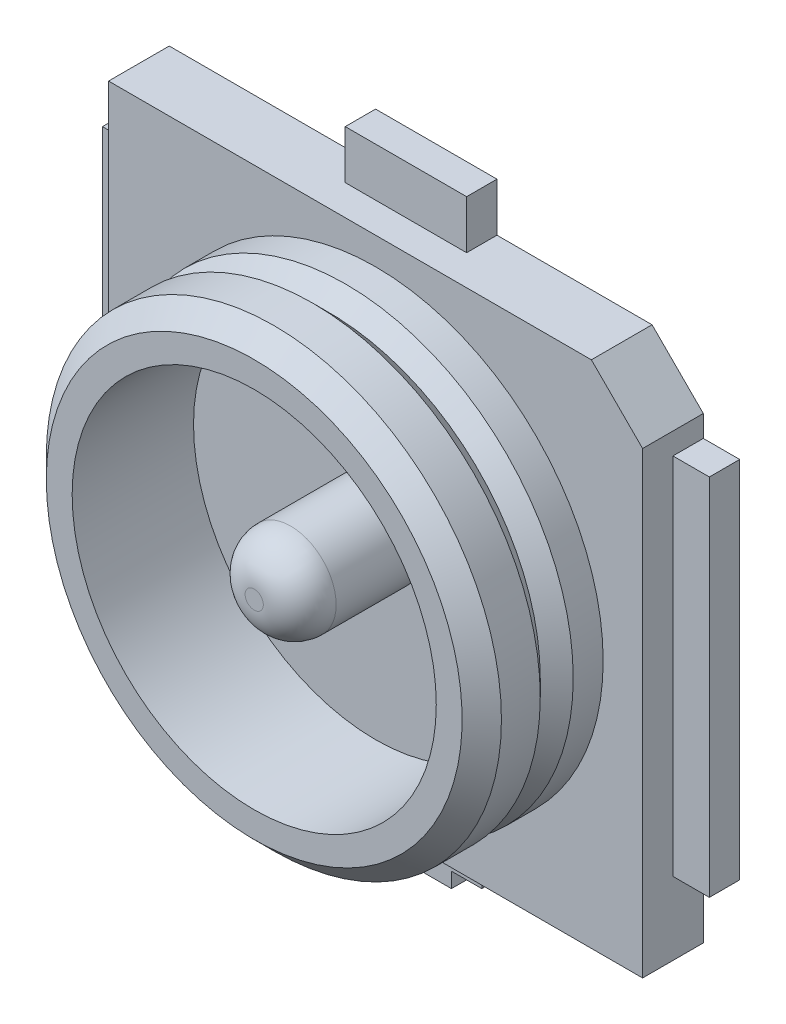
ISO-10303-21;
HEADER;
FILE_DESCRIPTION(('STEP AP214'),'2;1');
FILE_NAME('part.step','',(''),(''),'','','');
FILE_SCHEMA(('AUTOMOTIVE_DESIGN { 1 0 10303 214 1 1 1 1 }'));
ENDSEC;
DATA;
#1=APPLICATION_CONTEXT('core data for automotive mechanical design processes');
#2=APPLICATION_PROTOCOL_DEFINITION('international standard','automotive_design',2000,#1);
#3=PRODUCT_CONTEXT('',#1,'mechanical');
#4=PRODUCT('Part','Part','',(#3));
#5=PRODUCT_RELATED_PRODUCT_CATEGORY('part','',(#4));
#6=PRODUCT_DEFINITION_FORMATION('','',#4);
#7=PRODUCT_DEFINITION_CONTEXT('part definition',#1,'design');
#8=PRODUCT_DEFINITION('design','',#6,#7);
#9=PRODUCT_DEFINITION_SHAPE('','',#8);
#10=(LENGTH_UNIT() NAMED_UNIT(*) SI_UNIT(.MILLI.,.METRE.));
#11=(NAMED_UNIT(*) PLANE_ANGLE_UNIT() SI_UNIT($,.RADIAN.));
#12=(NAMED_UNIT(*) SI_UNIT($,.STERADIAN.) SOLID_ANGLE_UNIT());
#13=UNCERTAINTY_MEASURE_WITH_UNIT(LENGTH_MEASURE(1.E-05),#10,'distance_accuracy_value','');
#14=(GEOMETRIC_REPRESENTATION_CONTEXT(3) GLOBAL_UNCERTAINTY_ASSIGNED_CONTEXT((#13)) GLOBAL_UNIT_ASSIGNED_CONTEXT((#10,
#11,#12)) REPRESENTATION_CONTEXT('',''));
#15=CARTESIAN_POINT('',(0.,0.,0.));
#16=DIRECTION('',(0.,0.,1.));
#17=DIRECTION('',(1.,0.,0.));
#18=AXIS2_PLACEMENT_3D('',#15,#16,#17);
#19=CARTESIAN_POINT('',(0.88,-0.84,0.2));
#20=DIRECTION('',(-1.,0.,0.));
#21=DIRECTION('',(0.,-1.,0.));
#22=AXIS2_PLACEMENT_3D('',#19,#20,#21);
#23=PLANE('',#22);
#24=DIRECTION('',(0.,0.,-1.));
#25=VECTOR('',#24,1.);
#26=CARTESIAN_POINT('',(0.88,-0.6,0.1));
#27=LINE('',#26,#25);
#28=CARTESIAN_POINT('',(0.88,-0.6,0.1));
#29=VERTEX_POINT('',#28);
#30=CARTESIAN_POINT('',(0.88,-0.6,0.));
#31=VERTEX_POINT('',#30);
#32=EDGE_CURVE('E215',#29,#31,#27,.T.);
#33=ORIENTED_EDGE('',*,*,#32,.F.);
#34=DIRECTION('',(0.,-1.,0.));
#35=VECTOR('',#34,1.);
#36=CARTESIAN_POINT('',(0.88,0.6,0.1));
#37=LINE('',#36,#35);
#38=CARTESIAN_POINT('',(0.88,0.6,0.1));
#39=VERTEX_POINT('',#38);
#40=EDGE_CURVE('E223',#39,#29,#37,.T.);
#41=ORIENTED_EDGE('',*,*,#40,.F.);
#42=DIRECTION('',(0.,0.,-1.));
#43=VECTOR('',#42,1.);
#44=CARTESIAN_POINT('',(0.88,0.6,0.1));
#45=LINE('',#44,#43);
#46=CARTESIAN_POINT('',(0.88,0.6,0.));
#47=VERTEX_POINT('',#46);
#48=EDGE_CURVE('E585',#39,#47,#45,.T.);
#49=ORIENTED_EDGE('',*,*,#48,.T.);
#50=DIRECTION('',(0.,1.,0.));
#51=VECTOR('',#50,1.);
#52=CARTESIAN_POINT('',(0.88,-0.84,0.));
#53=LINE('',#52,#51);
#54=CARTESIAN_POINT('',(0.88,0.671160981319891,0.));
#55=VERTEX_POINT('',#54);
#56=EDGE_CURVE('E449',#47,#55,#53,.T.);
#57=ORIENTED_EDGE('',*,*,#56,.T.);
#58=DIRECTION('',(0.,0.,-1.));
#59=VECTOR('',#58,1.);
#60=CARTESIAN_POINT('',(0.88,0.671160981319891,0.2));
#61=LINE('',#60,#59);
#62=CARTESIAN_POINT('',(0.88,0.671160981319891,0.2));
#63=VERTEX_POINT('',#62);
#64=EDGE_CURVE('E463',#63,#55,#61,.T.);
#65=ORIENTED_EDGE('',*,*,#64,.F.);
#66=DIRECTION('',(0.,1.,0.));
#67=VECTOR('',#66,1.);
#68=CARTESIAN_POINT('',(0.88,-0.84,0.2));
#69=LINE('',#68,#67);
#70=CARTESIAN_POINT('',(0.88,-0.84,0.2));
#71=VERTEX_POINT('',#70);
#72=EDGE_CURVE('E429',#71,#63,#69,.T.);
#73=ORIENTED_EDGE('',*,*,#72,.F.);
#74=DIRECTION('',(0.,0.,-1.));
#75=VECTOR('',#74,1.);
#76=CARTESIAN_POINT('',(0.88,-0.84,0.2));
#77=LINE('',#76,#75);
#78=CARTESIAN_POINT('',(0.88,-0.84,0.));
#79=VERTEX_POINT('',#78);
#80=EDGE_CURVE('E460',#71,#79,#77,.T.);
#81=ORIENTED_EDGE('',*,*,#80,.T.);
#82=EDGE_CURVE('E234',#79,#31,#53,.T.);
#83=ORIENTED_EDGE('',*,*,#82,.T.);
#84=EDGE_LOOP('',(#33,#41,#49,#57,#65,#73,#81,#83));
#85=FACE_BOUND('',#84,.T.);
#86=ADVANCED_FACE('F39',(#85),#23,.F.);
#87=CARTESIAN_POINT('',(-0.88,-0.84,0.2));
#88=DIRECTION('',(0.,1.,0.));
#89=DIRECTION('',(0.,0.,1.));
#90=AXIS2_PLACEMENT_3D('',#87,#88,#89);
#91=PLANE('',#90);
#92=DIRECTION('',(0.,0.,-1.));
#93=VECTOR('',#92,1.);
#94=CARTESIAN_POINT('',(-0.25,-0.84,0.1));
#95=LINE('',#94,#93);
#96=CARTESIAN_POINT('',(-0.25,-0.84,0.1));
#97=VERTEX_POINT('',#96);
#98=CARTESIAN_POINT('',(-0.25,-0.84,0.));
#99=VERTEX_POINT('',#98);
#100=EDGE_CURVE('E304',#97,#99,#95,.T.);
#101=ORIENTED_EDGE('',*,*,#100,.F.);
#102=DIRECTION('',(-1.,0.,0.));
#103=VECTOR('',#102,1.);
#104=CARTESIAN_POINT('',(-0.25,-0.84,0.1));
#105=LINE('',#104,#103);
#106=CARTESIAN_POINT('',(0.25,-0.84,0.1));
#107=VERTEX_POINT('',#106);
#108=EDGE_CURVE('E301',#107,#97,#105,.T.);
#109=ORIENTED_EDGE('',*,*,#108,.F.);
#110=DIRECTION('',(0.,0.,-1.));
#111=VECTOR('',#110,1.);
#112=CARTESIAN_POINT('',(0.25,-0.84,0.1));
#113=LINE('',#112,#111);
#114=CARTESIAN_POINT('',(0.25,-0.84,0.));
#115=VERTEX_POINT('',#114);
#116=EDGE_CURVE('E327',#107,#115,#113,.T.);
#117=ORIENTED_EDGE('',*,*,#116,.T.);
#118=DIRECTION('',(1.,0.,0.));
#119=VECTOR('',#118,1.);
#120=CARTESIAN_POINT('',(-0.88,-0.84,0.));
#121=LINE('',#120,#119);
#122=EDGE_CURVE('E452',#115,#79,#121,.T.);
#123=ORIENTED_EDGE('',*,*,#122,.T.);
#124=ORIENTED_EDGE('',*,*,#80,.F.);
#125=DIRECTION('',(1.,0.,0.));
#126=VECTOR('',#125,1.);
#127=CARTESIAN_POINT('',(-0.88,-0.84,0.2));
#128=LINE('',#127,#126);
#129=CARTESIAN_POINT('',(-0.88,-0.84,0.2));
#130=VERTEX_POINT('',#129);
#131=EDGE_CURVE('E432',#130,#71,#128,.T.);
#132=ORIENTED_EDGE('',*,*,#131,.F.);
#133=DIRECTION('',(0.,0.,-1.));
#134=VECTOR('',#133,1.);
#135=CARTESIAN_POINT('',(-0.88,-0.84,0.2));
#136=LINE('',#135,#134);
#137=CARTESIAN_POINT('',(-0.88,-0.84,0.));
#138=VERTEX_POINT('',#137);
#139=EDGE_CURVE('E456',#130,#138,#136,.T.);
#140=ORIENTED_EDGE('',*,*,#139,.T.);
#141=EDGE_CURVE('E421',#138,#99,#121,.T.);
#142=ORIENTED_EDGE('',*,*,#141,.T.);
#143=EDGE_LOOP('',(#101,#109,#117,#123,#124,#132,#140,#142));
#144=FACE_BOUND('',#143,.T.);
#145=ADVANCED_FACE('F504',(#144),#91,.F.);
#146=CARTESIAN_POINT('',(0.,0.,0.2));
#147=DIRECTION('',(0.,0.,-1.));
#148=DIRECTION('',(-1.,0.,0.));
#149=AXIS2_PLACEMENT_3D('',#146,#147,#148);
#150=PLANE('',#149);
#151=DIRECTION('',(0.,1.,0.));
#152=VECTOR('',#151,1.);
#153=CARTESIAN_POINT('',(-0.88,-0.84,0.2));
#154=LINE('',#153,#152);
#155=CARTESIAN_POINT('',(-0.88,0.84,0.2));
#156=VERTEX_POINT('',#155);
#157=EDGE_CURVE('E416',#130,#156,#154,.T.);
#158=ORIENTED_EDGE('',*,*,#157,.F.);
#159=ORIENTED_EDGE('',*,*,#131,.T.);
#160=ORIENTED_EDGE('',*,*,#72,.T.);
#161=DIRECTION('',(0.707106781186556,-0.707106781186539,0.));
#162=VECTOR('',#161,1.);
#163=CARTESIAN_POINT('',(0.711160981319886,0.84,0.2));
#164=LINE('',#163,#162);
#165=CARTESIAN_POINT('',(0.711160981319886,0.84,0.2));
#166=VERTEX_POINT('',#165);
#167=EDGE_CURVE('E425',#166,#63,#164,.T.);
#168=ORIENTED_EDGE('',*,*,#167,.F.);
#169=DIRECTION('',(1.,0.,0.));
#170=VECTOR('',#169,1.);
#171=CARTESIAN_POINT('',(-0.88,0.84,0.2));
#172=LINE('',#171,#170);
#173=EDGE_CURVE('E420',#156,#166,#172,.T.);
#174=ORIENTED_EDGE('',*,*,#173,.F.);
#175=EDGE_LOOP('',(#158,#159,#160,#168,#174));
#176=FACE_BOUND('',#175,.T.);
#177=CARTESIAN_POINT('',(0.,0.,0.2));
#178=DIRECTION('',(0.,0.,-1.));
#179=DIRECTION('',(-1.,0.,0.));
#180=AXIS2_PLACEMENT_3D('',#177,#178,#179);
#181=CIRCLE('',#180,0.75);
#182=CARTESIAN_POINT('',(-0.75,0.,0.2));
#183=VERTEX_POINT('',#182);
#184=EDGE_CURVE('E477',#183,#183,#181,.F.);
#185=ORIENTED_EDGE('',*,*,#184,.F.);
#186=EDGE_LOOP('',(#185));
#187=FACE_BOUND('',#186,.T.);
#188=ADVANCED_FACE('F509',(#176,#187),#150,.F.);
#189=CARTESIAN_POINT('',(-0.88,-0.84,0.2));
#190=DIRECTION('',(-1.,0.,0.));
#191=DIRECTION('',(0.,0.,1.));
#192=AXIS2_PLACEMENT_3D('',#189,#190,#191);
#193=PLANE('',#192);
#194=DIRECTION('',(0.,0.,-1.));
#195=VECTOR('',#194,1.);
#196=CARTESIAN_POINT('',(-0.88,0.6,0.1));
#197=LINE('',#196,#195);
#198=CARTESIAN_POINT('',(-0.88,0.6,0.1));
#199=VERTEX_POINT('',#198);
#200=CARTESIAN_POINT('',(-0.88,0.6,0.));
#201=VERTEX_POINT('',#200);
#202=EDGE_CURVE('E273',#199,#201,#197,.T.);
#203=ORIENTED_EDGE('',*,*,#202,.F.);
#204=DIRECTION('',(0.,1.,0.));
#205=VECTOR('',#204,1.);
#206=CARTESIAN_POINT('',(-0.88,0.6,0.1));
#207=LINE('',#206,#205);
#208=CARTESIAN_POINT('',(-0.88,-0.6,0.1));
#209=VERTEX_POINT('',#208);
#210=EDGE_CURVE('E246',#209,#199,#207,.T.);
#211=ORIENTED_EDGE('',*,*,#210,.F.);
#212=DIRECTION('',(0.,0.,-1.));
#213=VECTOR('',#212,1.);
#214=CARTESIAN_POINT('',(-0.88,-0.6,0.1));
#215=LINE('',#214,#213);
#216=CARTESIAN_POINT('',(-0.88,-0.6,0.));
#217=VERTEX_POINT('',#216);
#218=EDGE_CURVE('E258',#209,#217,#215,.T.);
#219=ORIENTED_EDGE('',*,*,#218,.T.);
#220=DIRECTION('',(0.,1.,0.));
#221=VECTOR('',#220,1.);
#222=CARTESIAN_POINT('',(-0.88,-0.84,0.));
#223=LINE('',#222,#221);
#224=EDGE_CURVE('E436',#138,#217,#223,.T.);
#225=ORIENTED_EDGE('',*,*,#224,.F.);
#226=ORIENTED_EDGE('',*,*,#139,.F.);
#227=ORIENTED_EDGE('',*,*,#157,.T.);
#228=DIRECTION('',(0.,0.,-1.));
#229=VECTOR('',#228,1.);
#230=CARTESIAN_POINT('',(-0.88,0.84,0.2));
#231=LINE('',#230,#229);
#232=CARTESIAN_POINT('',(-0.88,0.84,0.));
#233=VERTEX_POINT('',#232);
#234=EDGE_CURVE('E435',#156,#233,#231,.T.);
#235=ORIENTED_EDGE('',*,*,#234,.T.);
#236=EDGE_CURVE('E415',#201,#233,#223,.T.);
#237=ORIENTED_EDGE('',*,*,#236,.F.);
#238=EDGE_LOOP('',(#203,#211,#219,#225,#226,#227,#235,#237));
#239=FACE_BOUND('',#238,.T.);
#240=ADVANCED_FACE('F518',(#239),#193,.T.);
#241=CARTESIAN_POINT('',(0.711160981319886,0.84,0.2));
#242=DIRECTION('',(0.707106781186539,0.707106781186556,0.));
#243=DIRECTION('',(-0.707106781186556,0.707106781186539,0.));
#244=AXIS2_PLACEMENT_3D('',#241,#242,#243);
#245=PLANE('',#244);
#246=DIRECTION('',(0.707106781186556,-0.707106781186539,0.));
#247=VECTOR('',#246,1.);
#248=CARTESIAN_POINT('',(0.711160981319886,0.84,0.));
#249=LINE('',#248,#247);
#250=CARTESIAN_POINT('',(0.711160981319886,0.84,0.));
#251=VERTEX_POINT('',#250);
#252=EDGE_CURVE('E445',#251,#55,#249,.T.);
#253=ORIENTED_EDGE('',*,*,#252,.F.);
#254=DIRECTION('',(0.,0.,-1.));
#255=VECTOR('',#254,1.);
#256=CARTESIAN_POINT('',(0.711160981319886,0.84,0.2));
#257=LINE('',#256,#255);
#258=EDGE_CURVE('E467',#166,#251,#257,.T.);
#259=ORIENTED_EDGE('',*,*,#258,.F.);
#260=ORIENTED_EDGE('',*,*,#167,.T.);
#261=ORIENTED_EDGE('',*,*,#64,.T.);
#262=EDGE_LOOP('',(#253,#259,#260,#261));
#263=FACE_BOUND('',#262,.T.);
#264=ADVANCED_FACE('F514',(#263),#245,.T.);
#265=CARTESIAN_POINT('',(-0.88,0.84,0.2));
#266=DIRECTION('',(0.,1.,0.));
#267=DIRECTION('',(0.,0.,1.));
#268=AXIS2_PLACEMENT_3D('',#265,#266,#267);
#269=PLANE('',#268);
#270=DIRECTION('',(0.,0.,-1.));
#271=VECTOR('',#270,1.);
#272=CARTESIAN_POINT('',(0.2,0.84,0.1));
#273=LINE('',#272,#271);
#274=CARTESIAN_POINT('',(0.2,0.84,0.1));
#275=VERTEX_POINT('',#274);
#276=CARTESIAN_POINT('',(0.2,0.84,0.));
#277=VERTEX_POINT('',#276);
#278=EDGE_CURVE('E384',#275,#277,#273,.T.);
#279=ORIENTED_EDGE('',*,*,#278,.F.);
#280=DIRECTION('',(1.,0.,0.));
#281=VECTOR('',#280,1.);
#282=CARTESIAN_POINT('',(-0.2,0.84,0.1));
#283=LINE('',#282,#281);
#284=CARTESIAN_POINT('',(-0.2,0.84,0.1));
#285=VERTEX_POINT('',#284);
#286=EDGE_CURVE('E359',#285,#275,#283,.T.);
#287=ORIENTED_EDGE('',*,*,#286,.F.);
#288=DIRECTION('',(0.,0.,-1.));
#289=VECTOR('',#288,1.);
#290=CARTESIAN_POINT('',(-0.2,0.84,0.1));
#291=LINE('',#290,#289);
#292=CARTESIAN_POINT('',(-0.2,0.84,0.));
#293=VERTEX_POINT('',#292);
#294=EDGE_CURVE('E387',#285,#293,#291,.T.);
#295=ORIENTED_EDGE('',*,*,#294,.T.);
#296=DIRECTION('',(1.,0.,0.));
#297=VECTOR('',#296,1.);
#298=CARTESIAN_POINT('',(-0.88,0.84,0.));
#299=LINE('',#298,#297);
#300=EDGE_CURVE('E441',#233,#293,#299,.T.);
#301=ORIENTED_EDGE('',*,*,#300,.F.);
#302=ORIENTED_EDGE('',*,*,#234,.F.);
#303=ORIENTED_EDGE('',*,*,#173,.T.);
#304=ORIENTED_EDGE('',*,*,#258,.T.);
#305=EDGE_CURVE('E440',#277,#251,#299,.T.);
#306=ORIENTED_EDGE('',*,*,#305,.F.);
#307=EDGE_LOOP('',(#279,#287,#295,#301,#302,#303,#304,#306));
#308=FACE_BOUND('',#307,.T.);
#309=ADVANCED_FACE('F517',(#308),#269,.T.);
#310=CARTESIAN_POINT('',(0.,0.,0.));
#311=DIRECTION('',(0.,0.,-1.));
#312=DIRECTION('',(-1.,0.,0.));
#313=AXIS2_PLACEMENT_3D('',#310,#311,#312);
#314=PLANE('',#313);
#315=ORIENTED_EDGE('',*,*,#224,.T.);
#316=DIRECTION('',(1.,0.,0.));
#317=VECTOR('',#316,1.);
#318=CARTESIAN_POINT('',(-0.88,-0.6,0.));
#319=LINE('',#318,#317);
#320=CARTESIAN_POINT('',(-1.,-0.6,0.));
#321=VERTEX_POINT('',#320);
#322=EDGE_CURVE('E63',#321,#217,#319,.T.);
#323=ORIENTED_EDGE('',*,*,#322,.F.);
#324=DIRECTION('',(0.,-1.,0.));
#325=VECTOR('',#324,1.);
#326=CARTESIAN_POINT('',(-1.,0.6,0.));
#327=LINE('',#326,#325);
#328=CARTESIAN_POINT('',(-1.,0.6,0.));
#329=VERTEX_POINT('',#328);
#330=EDGE_CURVE('E240',#329,#321,#327,.T.);
#331=ORIENTED_EDGE('',*,*,#330,.F.);
#332=DIRECTION('',(-1.,0.,0.));
#333=VECTOR('',#332,1.);
#334=CARTESIAN_POINT('',(-0.88,0.6,0.));
#335=LINE('',#334,#333);
#336=EDGE_CURVE('E236',#201,#329,#335,.T.);
#337=ORIENTED_EDGE('',*,*,#336,.F.);
#338=ORIENTED_EDGE('',*,*,#236,.T.);
#339=ORIENTED_EDGE('',*,*,#300,.T.);
#340=DIRECTION('',(0.,-1.,0.));
#341=VECTOR('',#340,1.);
#342=CARTESIAN_POINT('',(-0.2,0.84,0.));
#343=LINE('',#342,#341);
#344=CARTESIAN_POINT('',(-0.2,1.,0.));
#345=VERTEX_POINT('',#344);
#346=EDGE_CURVE('E355',#345,#293,#343,.T.);
#347=ORIENTED_EDGE('',*,*,#346,.F.);
#348=DIRECTION('',(-1.,0.,0.));
#349=VECTOR('',#348,1.);
#350=CARTESIAN_POINT('',(-0.2,1.,0.));
#351=LINE('',#350,#349);
#352=CARTESIAN_POINT('',(0.2,1.,0.));
#353=VERTEX_POINT('',#352);
#354=EDGE_CURVE('E360',#353,#345,#351,.T.);
#355=ORIENTED_EDGE('',*,*,#354,.F.);
#356=DIRECTION('',(0.,1.,0.));
#357=VECTOR('',#356,1.);
#358=CARTESIAN_POINT('',(0.2,0.84,0.));
#359=LINE('',#358,#357);
#360=EDGE_CURVE('E372',#277,#353,#359,.T.);
#361=ORIENTED_EDGE('',*,*,#360,.F.);
#362=ORIENTED_EDGE('',*,*,#305,.T.);
#363=ORIENTED_EDGE('',*,*,#252,.T.);
#364=ORIENTED_EDGE('',*,*,#56,.F.);
#365=DIRECTION('',(-1.,0.,0.));
#366=VECTOR('',#365,1.);
#367=CARTESIAN_POINT('',(0.88,0.6,0.));
#368=LINE('',#367,#366);
#369=CARTESIAN_POINT('',(1.,0.6,0.));
#370=VERTEX_POINT('',#369);
#371=EDGE_CURVE('E55',#370,#47,#368,.T.);
#372=ORIENTED_EDGE('',*,*,#371,.F.);
#373=DIRECTION('',(0.,1.,0.));
#374=VECTOR('',#373,1.);
#375=CARTESIAN_POINT('',(1.,0.6,0.));
#376=LINE('',#375,#374);
#377=CARTESIAN_POINT('',(1.,-0.6,0.));
#378=VERTEX_POINT('',#377);
#379=EDGE_CURVE('E575',#378,#370,#376,.T.);
#380=ORIENTED_EDGE('',*,*,#379,.F.);
#381=DIRECTION('',(1.,0.,0.));
#382=VECTOR('',#381,1.);
#383=CARTESIAN_POINT('',(0.88,-0.6,0.));
#384=LINE('',#383,#382);
#385=EDGE_CURVE('E574',#31,#378,#384,.T.);
#386=ORIENTED_EDGE('',*,*,#385,.F.);
#387=ORIENTED_EDGE('',*,*,#82,.F.);
#388=ORIENTED_EDGE('',*,*,#122,.F.);
#389=DIRECTION('',(0.,1.,0.));
#390=VECTOR('',#389,1.);
#391=CARTESIAN_POINT('',(0.25,-0.84,0.));
#392=LINE('',#391,#390);
#393=CARTESIAN_POINT('',(0.25,-0.95,0.));
#394=VERTEX_POINT('',#393);
#395=EDGE_CURVE('E283',#394,#115,#392,.T.);
#396=ORIENTED_EDGE('',*,*,#395,.F.);
#397=DIRECTION('',(1.,0.,0.));
#398=VECTOR('',#397,1.);
#399=CARTESIAN_POINT('',(0.25,-0.95,0.));
#400=LINE('',#399,#398);
#401=CARTESIAN_POINT('',(0.15,-0.95,0.));
#402=VERTEX_POINT('',#401);
#403=EDGE_CURVE('E320',#402,#394,#400,.T.);
#404=ORIENTED_EDGE('',*,*,#403,.F.);
#405=DIRECTION('',(0.,1.,0.));
#406=VECTOR('',#405,1.);
#407=CARTESIAN_POINT('',(0.15,-0.95,0.));
#408=LINE('',#407,#406);
#409=CARTESIAN_POINT('',(0.15,-1.,0.));
#410=VERTEX_POINT('',#409);
#411=EDGE_CURVE('E317',#410,#402,#408,.T.);
#412=ORIENTED_EDGE('',*,*,#411,.F.);
#413=DIRECTION('',(1.,0.,0.));
#414=VECTOR('',#413,1.);
#415=CARTESIAN_POINT('',(-0.15,-1.,0.));
#416=LINE('',#415,#414);
#417=CARTESIAN_POINT('',(-0.15,-1.,0.));
#418=VERTEX_POINT('',#417);
#419=EDGE_CURVE('E314',#418,#410,#416,.T.);
#420=ORIENTED_EDGE('',*,*,#419,.F.);
#421=DIRECTION('',(0.,-1.,0.));
#422=VECTOR('',#421,1.);
#423=CARTESIAN_POINT('',(-0.15,-0.95,0.));
#424=LINE('',#423,#422);
#425=CARTESIAN_POINT('',(-0.15,-0.95,0.));
#426=VERTEX_POINT('',#425);
#427=EDGE_CURVE('E311',#426,#418,#424,.T.);
#428=ORIENTED_EDGE('',*,*,#427,.F.);
#429=DIRECTION('',(1.,0.,0.));
#430=VECTOR('',#429,1.);
#431=CARTESIAN_POINT('',(-0.25,-0.95,0.));
#432=LINE('',#431,#430);
#433=CARTESIAN_POINT('',(-0.25,-0.95,0.));
#434=VERTEX_POINT('',#433);
#435=EDGE_CURVE('E308',#434,#426,#432,.T.);
#436=ORIENTED_EDGE('',*,*,#435,.F.);
#437=DIRECTION('',(0.,-1.,0.));
#438=VECTOR('',#437,1.);
#439=CARTESIAN_POINT('',(-0.25,-0.84,0.));
#440=LINE('',#439,#438);
#441=EDGE_CURVE('E277',#99,#434,#440,.T.);
#442=ORIENTED_EDGE('',*,*,#441,.F.);
#443=ORIENTED_EDGE('',*,*,#141,.F.);
#444=EDGE_LOOP('',(#315,#323,#331,#337,#338,#339,#347,#355,#361,#362,#363,#364,#372,#380,#386,
#387,#388,#396,#404,#412,#420,#428,#436,#442,#443));
#445=FACE_BOUND('',#444,.T.);
#446=ADVANCED_FACE('F521',(#445),#314,.T.);
#447=CARTESIAN_POINT('',(0.,0.,-0.03));
#448=DIRECTION('',(0.,0.,-1.));
#449=DIRECTION('',(-1.,0.,0.));
#450=AXIS2_PLACEMENT_3D('',#447,#448,#449);
#451=CYLINDRICAL_SURFACE('',#450,0.75);
#452=ORIENTED_EDGE('',*,*,#184,.T.);
#453=EDGE_LOOP('',(#452));
#454=FACE_BOUND('',#453,.T.);
#455=CARTESIAN_POINT('',(0.,0.,0.29866713519178));
#456=DIRECTION('',(0.,0.,-1.));
#457=DIRECTION('',(-1.,0.,0.));
#458=AXIS2_PLACEMENT_3D('',#455,#456,#457);
#459=CIRCLE('',#458,0.75);
#460=CARTESIAN_POINT('',(-0.75,0.,0.29866713519178));
#461=VERTEX_POINT('',#460);
#462=EDGE_CURVE('E411',#461,#461,#459,.T.);
#463=ORIENTED_EDGE('',*,*,#462,.T.);
#464=EDGE_LOOP('',(#463));
#465=FACE_BOUND('',#464,.T.);
#466=ADVANCED_FACE('F640',(#454,#465),#451,.T.);
#467=CARTESIAN_POINT('',(0.,0.,0.352996909509295));
#468=DIRECTION('',(0.,0.,-1.));
#469=DIRECTION('',(-1.,0.,0.));
#470=AXIS2_PLACEMENT_3D('',#467,#468,#469);
#471=CONICAL_SURFACE('',#470,0.695670225682484,0.785398163397448);
#472=ORIENTED_EDGE('',*,*,#462,.F.);
#473=EDGE_LOOP('',(#472));
#474=FACE_BOUND('',#473,.T.);
#475=CARTESIAN_POINT('',(0.,0.,0.352996909509295));
#476=DIRECTION('',(0.,0.,-1.));
#477=DIRECTION('',(-1.,0.,0.));
#478=AXIS2_PLACEMENT_3D('',#475,#476,#477);
#479=CIRCLE('',#478,0.695670225682484);
#480=CARTESIAN_POINT('',(-0.695670225682484,0.,0.352996909509295));
#481=VERTEX_POINT('',#480);
#482=EDGE_CURVE('E407',#481,#481,#479,.T.);
#483=ORIENTED_EDGE('',*,*,#482,.T.);
#484=EDGE_LOOP('',(#483));
#485=FACE_BOUND('',#484,.T.);
#486=ADVANCED_FACE('F636',(#474,#485),#471,.T.);
#487=CARTESIAN_POINT('',(0.,0.,0.40732668382681));
#488=DIRECTION('',(0.,0.,1.));
#489=DIRECTION('',(1.,0.,0.));
#490=AXIS2_PLACEMENT_3D('',#487,#488,#489);
#491=CONICAL_SURFACE('',#490,0.75,0.785398163397452);
#492=ORIENTED_EDGE('',*,*,#482,.F.);
#493=EDGE_LOOP('',(#492));
#494=FACE_BOUND('',#493,.T.);
#495=CARTESIAN_POINT('',(0.,0.,0.40732668382681));
#496=DIRECTION('',(0.,0.,-1.));
#497=DIRECTION('',(-1.,0.,0.));
#498=AXIS2_PLACEMENT_3D('',#495,#496,#497);
#499=CIRCLE('',#498,0.75);
#500=CARTESIAN_POINT('',(-0.75,0.,0.40732668382681));
#501=VERTEX_POINT('',#500);
#502=EDGE_CURVE('E403',#501,#501,#499,.T.);
#503=ORIENTED_EDGE('',*,*,#502,.T.);
#504=EDGE_LOOP('',(#503));
#505=FACE_BOUND('',#504,.T.);
#506=ADVANCED_FACE('F632',(#494,#505),#491,.T.);
#507=CARTESIAN_POINT('',(0.,0.,-0.03));
#508=DIRECTION('',(0.,0.,-1.));
#509=DIRECTION('',(-1.,0.,0.));
#510=AXIS2_PLACEMENT_3D('',#507,#508,#509);
#511=CYLINDRICAL_SURFACE('',#510,0.75);
#512=ORIENTED_EDGE('',*,*,#502,.F.);
#513=EDGE_LOOP('',(#512));
#514=FACE_BOUND('',#513,.T.);
#515=CARTESIAN_POINT('',(0.,0.,0.535218951629171));
#516=DIRECTION('',(0.,0.,-1.));
#517=DIRECTION('',(-1.,0.,0.));
#518=AXIS2_PLACEMENT_3D('',#515,#516,#517);
#519=CIRCLE('',#518,0.75);
#520=CARTESIAN_POINT('',(-0.75,0.,0.535218951629171));
#521=VERTEX_POINT('',#520);
#522=EDGE_CURVE('E399',#521,#521,#519,.T.);
#523=ORIENTED_EDGE('',*,*,#522,.T.);
#524=EDGE_LOOP('',(#523));
#525=FACE_BOUND('',#524,.T.);
#526=ADVANCED_FACE('F628',(#514,#525),#511,.T.);
#527=CARTESIAN_POINT('',(0.,0.,0.6));
#528=DIRECTION('',(0.,0.,-1.));
#529=DIRECTION('',(-1.,0.,0.));
#530=AXIS2_PLACEMENT_3D('',#527,#528,#529);
#531=CONICAL_SURFACE('',#530,0.685218951629171,0.785398163397446);
#532=ORIENTED_EDGE('',*,*,#522,.F.);
#533=EDGE_LOOP('',(#532));
#534=FACE_BOUND('',#533,.T.);
#535=CARTESIAN_POINT('',(0.,0.,0.6));
#536=DIRECTION('',(0.,0.,-1.));
#537=DIRECTION('',(-1.,0.,0.));
#538=AXIS2_PLACEMENT_3D('',#535,#536,#537);
#539=CIRCLE('',#538,0.685218951629171);
#540=CARTESIAN_POINT('',(-0.685218951629171,0.,0.6));
#541=VERTEX_POINT('',#540);
#542=EDGE_CURVE('E395',#541,#541,#539,.T.);
#543=ORIENTED_EDGE('',*,*,#542,.T.);
#544=EDGE_LOOP('',(#543));
#545=FACE_BOUND('',#544,.T.);
#546=ADVANCED_FACE('F624',(#534,#545),#531,.T.);
#547=CARTESIAN_POINT('',(0.685218951629171,0.,0.6));
#548=DIRECTION('',(0.,0.,-1.));
#549=DIRECTION('',(-1.,0.,0.));
#550=AXIS2_PLACEMENT_3D('',#547,#548,#549);
#551=PLANE('',#550);
#552=ORIENTED_EDGE('',*,*,#542,.F.);
#553=EDGE_LOOP('',(#552));
#554=FACE_BOUND('',#553,.T.);
#555=CARTESIAN_POINT('',(0.,0.,0.6));
#556=DIRECTION('',(0.,0.,-1.));
#557=DIRECTION('',(-1.,0.,0.));
#558=AXIS2_PLACEMENT_3D('',#555,#556,#557);
#559=CIRCLE('',#558,0.6);
#560=CARTESIAN_POINT('',(-0.6,0.,0.6));
#561=VERTEX_POINT('',#560);
#562=EDGE_CURVE('E391',#561,#561,#559,.T.);
#563=ORIENTED_EDGE('',*,*,#562,.T.);
#564=EDGE_LOOP('',(#563));
#565=FACE_BOUND('',#564,.T.);
#566=ADVANCED_FACE('F620',(#554,#565),#551,.F.);
#567=CARTESIAN_POINT('',(0.,0.,-0.03));
#568=DIRECTION('',(0.,0.,-1.));
#569=DIRECTION('',(-1.,0.,0.));
#570=AXIS2_PLACEMENT_3D('',#567,#568,#569);
#571=CYLINDRICAL_SURFACE('',#570,0.6);
#572=ORIENTED_EDGE('',*,*,#562,.F.);
#573=EDGE_LOOP('',(#572));
#574=FACE_BOUND('',#573,.T.);
#575=CARTESIAN_POINT('',(0.,0.,0.2));
#576=DIRECTION('',(0.,0.,-1.));
#577=DIRECTION('',(-1.,0.,0.));
#578=AXIS2_PLACEMENT_3D('',#575,#576,#577);
#579=CIRCLE('',#578,0.6);
#580=CARTESIAN_POINT('',(-0.6,0.,0.2));
#581=VERTEX_POINT('',#580);
#582=EDGE_CURVE('E459',#581,#581,#579,.T.);
#583=ORIENTED_EDGE('',*,*,#582,.T.);
#584=EDGE_LOOP('',(#583));
#585=FACE_BOUND('',#584,.T.);
#586=ADVANCED_FACE('F617',(#574,#585),#571,.F.);
#587=CARTESIAN_POINT('',(0.,0.,0.2));
#588=DIRECTION('',(0.,0.,-1.));
#589=DIRECTION('',(-1.,0.,0.));
#590=AXIS2_PLACEMENT_3D('',#587,#588,#589);
#591=CIRCLE('',#590,0.15);
#592=CARTESIAN_POINT('',(-0.15,0.,0.2));
#593=VERTEX_POINT('',#592);
#594=EDGE_CURVE('E481',#593,#593,#591,.F.);
#595=ORIENTED_EDGE('',*,*,#594,.F.);
#596=EDGE_LOOP('',(#595));
#597=FACE_BOUND('',#596,.T.);
#598=ORIENTED_EDGE('',*,*,#582,.F.);
#599=EDGE_LOOP('',(#598));
#600=FACE_BOUND('',#599,.T.);
#601=ADVANCED_FACE('F530',(#597,#600),#150,.F.);
#602=CARTESIAN_POINT('',(0.,0.,0.6));
#603=DIRECTION('',(0.,0.,-1.));
#604=DIRECTION('',(-1.,0.,0.));
#605=AXIS2_PLACEMENT_3D('',#602,#603,#604);
#606=CYLINDRICAL_SURFACE('',#605,0.15);
#607=CARTESIAN_POINT('',(0.,0.,0.48));
#608=DIRECTION('',(0.,0.,1.));
#609=DIRECTION('',(1.,0.,0.));
#610=AXIS2_PLACEMENT_3D('',#607,#608,#609);
#611=CIRCLE('',#610,0.15);
#612=CARTESIAN_POINT('',(0.15,0.,0.48));
#613=VERTEX_POINT('',#612);
#614=EDGE_CURVE('E11',#613,#613,#611,.F.);
#615=ORIENTED_EDGE('',*,*,#614,.T.);
#616=EDGE_LOOP('',(#615));
#617=FACE_BOUND('',#616,.T.);
#618=ORIENTED_EDGE('',*,*,#594,.T.);
#619=EDGE_LOOP('',(#618));
#620=FACE_BOUND('',#619,.T.);
#621=ADVANCED_FACE('F500',(#617,#620),#606,.T.);
#622=CARTESIAN_POINT('',(0.,0.,0.6));
#623=DIRECTION('',(0.,0.,1.));
#624=DIRECTION('',(1.,0.,0.));
#625=AXIS2_PLACEMENT_3D('',#622,#623,#624);
#626=PLANE('',#625);
#627=CARTESIAN_POINT('',(0.,0.,0.6));
#628=DIRECTION('',(0.,0.,1.));
#629=DIRECTION('',(1.,0.,0.));
#630=AXIS2_PLACEMENT_3D('',#627,#628,#629);
#631=CIRCLE('',#630,0.03);
#632=CARTESIAN_POINT('',(0.03,0.,0.6));
#633=VERTEX_POINT('',#632);
#634=EDGE_CURVE('E48',#633,#633,#631,.T.);
#635=ORIENTED_EDGE('',*,*,#634,.T.);
#636=EDGE_LOOP('',(#635));
#637=FACE_BOUND('',#636,.T.);
#638=ADVANCED_FACE('F488',(#637),#626,.T.);
#639=CARTESIAN_POINT('',(0.,0.,0.48));
#640=DIRECTION('',(0.,0.,1.));
#641=DIRECTION('',(1.,0.,0.));
#642=AXIS2_PLACEMENT_3D('',#639,#640,#641);
#643=DEGENERATE_TOROIDAL_SURFACE('',#642,0.03,0.12,.T.);
#644=ORIENTED_EDGE('',*,*,#614,.F.);
#645=EDGE_LOOP('',(#644));
#646=FACE_BOUND('',#645,.T.);
#647=ORIENTED_EDGE('',*,*,#634,.F.);
#648=EDGE_LOOP('',(#647));
#649=FACE_BOUND('',#648,.T.);
#650=ADVANCED_FACE('F41',(#646,#649),#643,.T.);
#651=CARTESIAN_POINT('',(-0.2,0.84,0.1));
#652=DIRECTION('',(1.,0.,0.));
#653=DIRECTION('',(0.,0.,-1.));
#654=AXIS2_PLACEMENT_3D('',#651,#652,#653);
#655=PLANE('',#654);
#656=ORIENTED_EDGE('',*,*,#346,.T.);
#657=ORIENTED_EDGE('',*,*,#294,.F.);
#658=DIRECTION('',(0.,-1.,0.));
#659=VECTOR('',#658,1.);
#660=CARTESIAN_POINT('',(-0.2,0.84,0.1));
#661=LINE('',#660,#659);
#662=CARTESIAN_POINT('',(-0.2,1.,0.1));
#663=VERTEX_POINT('',#662);
#664=EDGE_CURVE('E356',#663,#285,#661,.T.);
#665=ORIENTED_EDGE('',*,*,#664,.F.);
#666=DIRECTION('',(0.,0.,-1.));
#667=VECTOR('',#666,1.);
#668=CARTESIAN_POINT('',(-0.2,1.,0.1));
#669=LINE('',#668,#667);
#670=EDGE_CURVE('E369',#663,#345,#669,.T.);
#671=ORIENTED_EDGE('',*,*,#670,.T.);
#672=EDGE_LOOP('',(#656,#657,#665,#671));
#673=FACE_BOUND('',#672,.T.);
#674=ADVANCED_FACE('F491',(#673),#655,.F.);
#675=CARTESIAN_POINT('',(0.2,0.84,0.1));
#676=DIRECTION('',(-1.,0.,0.));
#677=DIRECTION('',(0.,-1.,0.));
#678=AXIS2_PLACEMENT_3D('',#675,#676,#677);
#679=PLANE('',#678);
#680=ORIENTED_EDGE('',*,*,#360,.T.);
#681=DIRECTION('',(0.,0.,-1.));
#682=VECTOR('',#681,1.);
#683=CARTESIAN_POINT('',(0.2,1.,0.1));
#684=LINE('',#683,#682);
#685=CARTESIAN_POINT('',(0.2,1.,0.1));
#686=VERTEX_POINT('',#685);
#687=EDGE_CURVE('E380',#686,#353,#684,.T.);
#688=ORIENTED_EDGE('',*,*,#687,.F.);
#689=DIRECTION('',(0.,1.,0.));
#690=VECTOR('',#689,1.);
#691=CARTESIAN_POINT('',(0.2,0.84,0.1));
#692=LINE('',#691,#690);
#693=EDGE_CURVE('E363',#275,#686,#692,.T.);
#694=ORIENTED_EDGE('',*,*,#693,.F.);
#695=ORIENTED_EDGE('',*,*,#278,.T.);
#696=EDGE_LOOP('',(#680,#688,#694,#695));
#697=FACE_BOUND('',#696,.T.);
#698=ADVANCED_FACE('F497',(#697),#679,.F.);
#699=CARTESIAN_POINT('',(-0.2,1.,0.1));
#700=DIRECTION('',(0.,-1.,0.));
#701=DIRECTION('',(0.,0.,-1.));
#702=AXIS2_PLACEMENT_3D('',#699,#700,#701);
#703=PLANE('',#702);
#704=ORIENTED_EDGE('',*,*,#354,.T.);
#705=ORIENTED_EDGE('',*,*,#670,.F.);
#706=DIRECTION('',(-1.,0.,0.));
#707=VECTOR('',#706,1.);
#708=CARTESIAN_POINT('',(-0.2,1.,0.1));
#709=LINE('',#708,#707);
#710=EDGE_CURVE('E366',#686,#663,#709,.T.);
#711=ORIENTED_EDGE('',*,*,#710,.F.);
#712=ORIENTED_EDGE('',*,*,#687,.T.);
#713=EDGE_LOOP('',(#704,#705,#711,#712));
#714=FACE_BOUND('',#713,.T.);
#715=ADVANCED_FACE('F602',(#714),#703,.F.);
#716=CARTESIAN_POINT('',(0.,0.,0.1));
#717=DIRECTION('',(0.,0.,-1.));
#718=DIRECTION('',(-1.,0.,0.));
#719=AXIS2_PLACEMENT_3D('',#716,#717,#718);
#720=PLANE('',#719);
#721=ORIENTED_EDGE('',*,*,#664,.T.);
#722=ORIENTED_EDGE('',*,*,#286,.T.);
#723=ORIENTED_EDGE('',*,*,#693,.T.);
#724=ORIENTED_EDGE('',*,*,#710,.T.);
#725=EDGE_LOOP('',(#721,#722,#723,#724));
#726=FACE_BOUND('',#725,.T.);
#727=ADVANCED_FACE('F598',(#726),#720,.F.);
#728=CARTESIAN_POINT('',(-0.25,-0.84,0.1));
#729=DIRECTION('',(1.,0.,0.));
#730=DIRECTION('',(0.,0.,-1.));
#731=AXIS2_PLACEMENT_3D('',#728,#729,#730);
#732=PLANE('',#731);
#733=ORIENTED_EDGE('',*,*,#441,.T.);
#734=DIRECTION('',(0.,0.,-1.));
#735=VECTOR('',#734,1.);
#736=CARTESIAN_POINT('',(-0.25,-0.95,0.1));
#737=LINE('',#736,#735);
#738=CARTESIAN_POINT('',(-0.25,-0.95,0.1));
#739=VERTEX_POINT('',#738);
#740=EDGE_CURVE('E351',#739,#434,#737,.T.);
#741=ORIENTED_EDGE('',*,*,#740,.F.);
#742=DIRECTION('',(0.,-1.,0.));
#743=VECTOR('',#742,1.);
#744=CARTESIAN_POINT('',(-0.25,-0.84,0.1));
#745=LINE('',#744,#743);
#746=EDGE_CURVE('E278',#97,#739,#745,.T.);
#747=ORIENTED_EDGE('',*,*,#746,.F.);
#748=ORIENTED_EDGE('',*,*,#100,.T.);
#749=EDGE_LOOP('',(#733,#741,#747,#748));
#750=FACE_BOUND('',#749,.T.);
#751=ADVANCED_FACE('F609',(#750),#732,.F.);
#752=CARTESIAN_POINT('',(-0.25,-0.95,0.1));
#753=DIRECTION('',(0.,1.,0.));
#754=DIRECTION('',(-1.,0.,0.));
#755=AXIS2_PLACEMENT_3D('',#752,#753,#754);
#756=PLANE('',#755);
#757=ORIENTED_EDGE('',*,*,#435,.T.);
#758=DIRECTION('',(0.,0.,-1.));
#759=VECTOR('',#758,1.);
#760=CARTESIAN_POINT('',(-0.15,-0.95,0.1));
#761=LINE('',#760,#759);
#762=CARTESIAN_POINT('',(-0.15,-0.95,0.1));
#763=VERTEX_POINT('',#762);
#764=EDGE_CURVE('E347',#763,#426,#761,.T.);
#765=ORIENTED_EDGE('',*,*,#764,.F.);
#766=DIRECTION('',(1.,0.,0.));
#767=VECTOR('',#766,1.);
#768=CARTESIAN_POINT('',(-0.25,-0.95,0.1));
#769=LINE('',#768,#767);
#770=EDGE_CURVE('E282',#739,#763,#769,.T.);
#771=ORIENTED_EDGE('',*,*,#770,.F.);
#772=ORIENTED_EDGE('',*,*,#740,.T.);
#773=EDGE_LOOP('',(#757,#765,#771,#772));
#774=FACE_BOUND('',#773,.T.);
#775=ADVANCED_FACE('F786',(#774),#756,.F.);
#776=CARTESIAN_POINT('',(-0.15,-0.95,0.1));
#777=DIRECTION('',(1.,0.,0.));
#778=DIRECTION('',(0.,0.,-1.));
#779=AXIS2_PLACEMENT_3D('',#776,#777,#778);
#780=PLANE('',#779);
#781=ORIENTED_EDGE('',*,*,#427,.T.);
#782=DIRECTION('',(0.,0.,-1.));
#783=VECTOR('',#782,1.);
#784=CARTESIAN_POINT('',(-0.15,-1.,0.1));
#785=LINE('',#784,#783);
#786=CARTESIAN_POINT('',(-0.15,-1.,0.1));
#787=VERTEX_POINT('',#786);
#788=EDGE_CURVE('E343',#787,#418,#785,.T.);
#789=ORIENTED_EDGE('',*,*,#788,.F.);
#790=DIRECTION('',(0.,-1.,0.));
#791=VECTOR('',#790,1.);
#792=CARTESIAN_POINT('',(-0.15,-0.95,0.1));
#793=LINE('',#792,#791);
#794=EDGE_CURVE('E286',#763,#787,#793,.T.);
#795=ORIENTED_EDGE('',*,*,#794,.F.);
#796=ORIENTED_EDGE('',*,*,#764,.T.);
#797=EDGE_LOOP('',(#781,#789,#795,#796));
#798=FACE_BOUND('',#797,.T.);
#799=ADVANCED_FACE('F794',(#798),#780,.F.);
#800=CARTESIAN_POINT('',(-0.15,-1.,0.1));
#801=DIRECTION('',(0.,1.,0.));
#802=DIRECTION('',(0.,0.,1.));
#803=AXIS2_PLACEMENT_3D('',#800,#801,#802);
#804=PLANE('',#803);
#805=ORIENTED_EDGE('',*,*,#419,.T.);
#806=DIRECTION('',(0.,0.,-1.));
#807=VECTOR('',#806,1.);
#808=CARTESIAN_POINT('',(0.15,-1.,0.1));
#809=LINE('',#808,#807);
#810=CARTESIAN_POINT('',(0.15,-1.,0.1));
#811=VERTEX_POINT('',#810);
#812=EDGE_CURVE('E339',#811,#410,#809,.T.);
#813=ORIENTED_EDGE('',*,*,#812,.F.);
#814=DIRECTION('',(1.,0.,0.));
#815=VECTOR('',#814,1.);
#816=CARTESIAN_POINT('',(-0.15,-1.,0.1));
#817=LINE('',#816,#815);
#818=EDGE_CURVE('E289',#787,#811,#817,.T.);
#819=ORIENTED_EDGE('',*,*,#818,.F.);
#820=ORIENTED_EDGE('',*,*,#788,.T.);
#821=EDGE_LOOP('',(#805,#813,#819,#820));
#822=FACE_BOUND('',#821,.T.);
#823=ADVANCED_FACE('F803',(#822),#804,.F.);
#824=CARTESIAN_POINT('',(0.15,-0.95,0.1));
#825=DIRECTION('',(-1.,0.,0.));
#826=DIRECTION('',(0.,0.,1.));
#827=AXIS2_PLACEMENT_3D('',#824,#825,#826);
#828=PLANE('',#827);
#829=ORIENTED_EDGE('',*,*,#411,.T.);
#830=DIRECTION('',(0.,0.,-1.));
#831=VECTOR('',#830,1.);
#832=CARTESIAN_POINT('',(0.15,-0.95,0.1));
#833=LINE('',#832,#831);
#834=CARTESIAN_POINT('',(0.15,-0.95,0.1));
#835=VERTEX_POINT('',#834);
#836=EDGE_CURVE('E335',#835,#402,#833,.T.);
#837=ORIENTED_EDGE('',*,*,#836,.F.);
#838=DIRECTION('',(0.,1.,0.));
#839=VECTOR('',#838,1.);
#840=CARTESIAN_POINT('',(0.15,-0.95,0.1));
#841=LINE('',#840,#839);
#842=EDGE_CURVE('E292',#811,#835,#841,.T.);
#843=ORIENTED_EDGE('',*,*,#842,.F.);
#844=ORIENTED_EDGE('',*,*,#812,.T.);
#845=EDGE_LOOP('',(#829,#837,#843,#844));
#846=FACE_BOUND('',#845,.T.);
#847=ADVANCED_FACE('F812',(#846),#828,.F.);
#848=CARTESIAN_POINT('',(0.25,-0.95,0.1));
#849=DIRECTION('',(0.,1.,0.));
#850=DIRECTION('',(0.,0.,1.));
#851=AXIS2_PLACEMENT_3D('',#848,#849,#850);
#852=PLANE('',#851);
#853=ORIENTED_EDGE('',*,*,#403,.T.);
#854=DIRECTION('',(0.,0.,-1.));
#855=VECTOR('',#854,1.);
#856=CARTESIAN_POINT('',(0.25,-0.95,0.1));
#857=LINE('',#856,#855);
#858=CARTESIAN_POINT('',(0.25,-0.95,0.1));
#859=VERTEX_POINT('',#858);
#860=EDGE_CURVE('E331',#859,#394,#857,.T.);
#861=ORIENTED_EDGE('',*,*,#860,.F.);
#862=DIRECTION('',(1.,0.,0.));
#863=VECTOR('',#862,1.);
#864=CARTESIAN_POINT('',(0.25,-0.95,0.1));
#865=LINE('',#864,#863);
#866=EDGE_CURVE('E295',#835,#859,#865,.T.);
#867=ORIENTED_EDGE('',*,*,#866,.F.);
#868=ORIENTED_EDGE('',*,*,#836,.T.);
#869=EDGE_LOOP('',(#853,#861,#867,#868));
#870=FACE_BOUND('',#869,.T.);
#871=ADVANCED_FACE('F821',(#870),#852,.F.);
#872=CARTESIAN_POINT('',(0.25,-0.84,0.1));
#873=DIRECTION('',(-1.,0.,0.));
#874=DIRECTION('',(0.,-1.,0.));
#875=AXIS2_PLACEMENT_3D('',#872,#873,#874);
#876=PLANE('',#875);
#877=ORIENTED_EDGE('',*,*,#395,.T.);
#878=ORIENTED_EDGE('',*,*,#116,.F.);
#879=DIRECTION('',(0.,1.,0.));
#880=VECTOR('',#879,1.);
#881=CARTESIAN_POINT('',(0.25,-0.84,0.1));
#882=LINE('',#881,#880);
#883=EDGE_CURVE('E298',#859,#107,#882,.T.);
#884=ORIENTED_EDGE('',*,*,#883,.F.);
#885=ORIENTED_EDGE('',*,*,#860,.T.);
#886=EDGE_LOOP('',(#877,#878,#884,#885));
#887=FACE_BOUND('',#886,.T.);
#888=ADVANCED_FACE('F830',(#887),#876,.F.);
#889=CARTESIAN_POINT('',(0.,0.,0.1));
#890=DIRECTION('',(0.,0.,1.));
#891=DIRECTION('',(1.,0.,0.));
#892=AXIS2_PLACEMENT_3D('',#889,#890,#891);
#893=PLANE('',#892);
#894=ORIENTED_EDGE('',*,*,#746,.T.);
#895=ORIENTED_EDGE('',*,*,#770,.T.);
#896=ORIENTED_EDGE('',*,*,#794,.T.);
#897=ORIENTED_EDGE('',*,*,#818,.T.);
#898=ORIENTED_EDGE('',*,*,#842,.T.);
#899=ORIENTED_EDGE('',*,*,#866,.T.);
#900=ORIENTED_EDGE('',*,*,#883,.T.);
#901=ORIENTED_EDGE('',*,*,#108,.T.);
#902=EDGE_LOOP('',(#894,#895,#896,#897,#898,#899,#900,#901));
#903=FACE_BOUND('',#902,.T.);
#904=ADVANCED_FACE('F839',(#903),#893,.T.);
#905=CARTESIAN_POINT('',(-0.88,0.6,0.1));
#906=DIRECTION('',(0.,-1.,0.));
#907=DIRECTION('',(0.,0.,-1.));
#908=AXIS2_PLACEMENT_3D('',#905,#906,#907);
#909=PLANE('',#908);
#910=ORIENTED_EDGE('',*,*,#336,.T.);
#911=DIRECTION('',(0.,0.,-1.));
#912=VECTOR('',#911,1.);
#913=CARTESIAN_POINT('',(-1.,0.6,0.1));
#914=LINE('',#913,#912);
#915=CARTESIAN_POINT('',(-1.,0.6,0.1));
#916=VERTEX_POINT('',#915);
#917=EDGE_CURVE('E269',#916,#329,#914,.T.);
#918=ORIENTED_EDGE('',*,*,#917,.F.);
#919=DIRECTION('',(-1.,0.,0.));
#920=VECTOR('',#919,1.);
#921=CARTESIAN_POINT('',(-0.88,0.6,0.1));
#922=LINE('',#921,#920);
#923=EDGE_CURVE('E250',#199,#916,#922,.T.);
#924=ORIENTED_EDGE('',*,*,#923,.F.);
#925=ORIENTED_EDGE('',*,*,#202,.T.);
#926=EDGE_LOOP('',(#910,#918,#924,#925));
#927=FACE_BOUND('',#926,.T.);
#928=ADVANCED_FACE('F535',(#927),#909,.F.);
#929=CARTESIAN_POINT('',(-1.,0.6,0.1));
#930=DIRECTION('',(1.,0.,0.));
#931=DIRECTION('',(0.,0.,-1.));
#932=AXIS2_PLACEMENT_3D('',#929,#930,#931);
#933=PLANE('',#932);
#934=ORIENTED_EDGE('',*,*,#330,.T.);
#935=DIRECTION('',(0.,0.,-1.));
#936=VECTOR('',#935,1.);
#937=CARTESIAN_POINT('',(-1.,-0.6,0.1));
#938=LINE('',#937,#936);
#939=CARTESIAN_POINT('',(-1.,-0.6,0.1));
#940=VERTEX_POINT('',#939);
#941=EDGE_CURVE('E266',#940,#321,#938,.T.);
#942=ORIENTED_EDGE('',*,*,#941,.F.);
#943=DIRECTION('',(0.,-1.,0.));
#944=VECTOR('',#943,1.);
#945=CARTESIAN_POINT('',(-1.,0.6,0.1));
#946=LINE('',#945,#944);
#947=EDGE_CURVE('E253',#916,#940,#946,.T.);
#948=ORIENTED_EDGE('',*,*,#947,.F.);
#949=ORIENTED_EDGE('',*,*,#917,.T.);
#950=EDGE_LOOP('',(#934,#942,#948,#949));
#951=FACE_BOUND('',#950,.T.);
#952=ADVANCED_FACE('F856',(#951),#933,.F.);
#953=CARTESIAN_POINT('',(-0.88,-0.6,0.1));
#954=DIRECTION('',(0.,1.,0.));
#955=DIRECTION('',(0.,0.,1.));
#956=AXIS2_PLACEMENT_3D('',#953,#954,#955);
#957=PLANE('',#956);
#958=ORIENTED_EDGE('',*,*,#322,.T.);
#959=ORIENTED_EDGE('',*,*,#218,.F.);
#960=DIRECTION('',(1.,0.,0.));
#961=VECTOR('',#960,1.);
#962=CARTESIAN_POINT('',(-0.88,-0.6,0.1));
#963=LINE('',#962,#961);
#964=EDGE_CURVE('E256',#940,#209,#963,.T.);
#965=ORIENTED_EDGE('',*,*,#964,.F.);
#966=ORIENTED_EDGE('',*,*,#941,.T.);
#967=EDGE_LOOP('',(#958,#959,#965,#966));
#968=FACE_BOUND('',#967,.T.);
#969=ADVANCED_FACE('F542',(#968),#957,.F.);
#970=CARTESIAN_POINT('',(0.,0.,0.1));
#971=DIRECTION('',(0.,0.,-1.));
#972=DIRECTION('',(-1.,0.,0.));
#973=AXIS2_PLACEMENT_3D('',#970,#971,#972);
#974=PLANE('',#973);
#975=ORIENTED_EDGE('',*,*,#210,.T.);
#976=ORIENTED_EDGE('',*,*,#923,.T.);
#977=ORIENTED_EDGE('',*,*,#947,.T.);
#978=ORIENTED_EDGE('',*,*,#964,.T.);
#979=EDGE_LOOP('',(#975,#976,#977,#978));
#980=FACE_BOUND('',#979,.T.);
#981=ADVANCED_FACE('F539',(#980),#974,.F.);
#982=CARTESIAN_POINT('',(0.88,-0.6,0.1));
#983=DIRECTION('',(0.,1.,0.));
#984=DIRECTION('',(0.,0.,1.));
#985=AXIS2_PLACEMENT_3D('',#982,#983,#984);
#986=PLANE('',#985);
#987=ORIENTED_EDGE('',*,*,#385,.T.);
#988=DIRECTION('',(0.,0.,-1.));
#989=VECTOR('',#988,1.);
#990=CARTESIAN_POINT('',(1.,-0.6,0.1));
#991=LINE('',#990,#989);
#992=CARTESIAN_POINT('',(1.,-0.6,0.1));
#993=VERTEX_POINT('',#992);
#994=EDGE_CURVE('E218',#993,#378,#991,.T.);
#995=ORIENTED_EDGE('',*,*,#994,.F.);
#996=DIRECTION('',(1.,0.,0.));
#997=VECTOR('',#996,1.);
#998=CARTESIAN_POINT('',(0.88,-0.6,0.1));
#999=LINE('',#998,#997);
#1000=EDGE_CURVE('E211',#29,#993,#999,.T.);
#1001=ORIENTED_EDGE('',*,*,#1000,.F.);
#1002=ORIENTED_EDGE('',*,*,#32,.T.);
#1003=EDGE_LOOP('',(#987,#995,#1001,#1002));
#1004=FACE_BOUND('',#1003,.T.);
#1005=ADVANCED_FACE('F213',(#1004),#986,.F.);
#1006=CARTESIAN_POINT('',(1.,0.6,0.1));
#1007=DIRECTION('',(-1.,0.,0.));
#1008=DIRECTION('',(0.,0.,1.));
#1009=AXIS2_PLACEMENT_3D('',#1006,#1007,#1008);
#1010=PLANE('',#1009);
#1011=ORIENTED_EDGE('',*,*,#379,.T.);
#1012=DIRECTION('',(0.,0.,-1.));
#1013=VECTOR('',#1012,1.);
#1014=CARTESIAN_POINT('',(1.,0.6,0.1));
#1015=LINE('',#1014,#1013);
#1016=CARTESIAN_POINT('',(1.,0.6,0.1));
#1017=VERTEX_POINT('',#1016);
#1018=EDGE_CURVE('E242',#1017,#370,#1015,.T.);
#1019=ORIENTED_EDGE('',*,*,#1018,.F.);
#1020=DIRECTION('',(0.,1.,0.));
#1021=VECTOR('',#1020,1.);
#1022=CARTESIAN_POINT('',(1.,0.6,0.1));
#1023=LINE('',#1022,#1021);
#1024=EDGE_CURVE('E222',#993,#1017,#1023,.T.);
#1025=ORIENTED_EDGE('',*,*,#1024,.F.);
#1026=ORIENTED_EDGE('',*,*,#994,.T.);
#1027=EDGE_LOOP('',(#1011,#1019,#1025,#1026));
#1028=FACE_BOUND('',#1027,.T.);
#1029=ADVANCED_FACE('F886',(#1028),#1010,.F.);
#1030=CARTESIAN_POINT('',(0.88,0.6,0.1));
#1031=DIRECTION('',(0.,-1.,0.));
#1032=DIRECTION('',(0.,0.,-1.));
#1033=AXIS2_PLACEMENT_3D('',#1030,#1031,#1032);
#1034=PLANE('',#1033);
#1035=ORIENTED_EDGE('',*,*,#371,.T.);
#1036=ORIENTED_EDGE('',*,*,#48,.F.);
#1037=DIRECTION('',(-1.,0.,0.));
#1038=VECTOR('',#1037,1.);
#1039=CARTESIAN_POINT('',(0.88,0.6,0.1));
#1040=LINE('',#1039,#1038);
#1041=EDGE_CURVE('E228',#1017,#39,#1040,.T.);
#1042=ORIENTED_EDGE('',*,*,#1041,.F.);
#1043=ORIENTED_EDGE('',*,*,#1018,.T.);
#1044=EDGE_LOOP('',(#1035,#1036,#1042,#1043));
#1045=FACE_BOUND('',#1044,.T.);
#1046=ADVANCED_FACE('F589',(#1045),#1034,.F.);
#1047=CARTESIAN_POINT('',(0.,0.,0.1));
#1048=DIRECTION('',(0.,0.,1.));
#1049=DIRECTION('',(1.,0.,0.));
#1050=AXIS2_PLACEMENT_3D('',#1047,#1048,#1049);
#1051=PLANE('',#1050);
#1052=ORIENTED_EDGE('',*,*,#40,.T.);
#1053=ORIENTED_EDGE('',*,*,#1000,.T.);
#1054=ORIENTED_EDGE('',*,*,#1024,.T.);
#1055=ORIENTED_EDGE('',*,*,#1041,.T.);
#1056=EDGE_LOOP('',(#1052,#1053,#1054,#1055));
#1057=FACE_BOUND('',#1056,.T.);
#1058=ADVANCED_FACE('F226',(#1057),#1051,.T.);
#1059=CLOSED_SHELL('',(#86,#145,#188,#240,#264,#309,#446,#466,#486,#506,#526,#546,#566,#586,
#601,#621,#638,#650,#674,#698,#715,#727,#751,#775,#799,#823,#847,#871,#888,#904,#928,#952,#969,
#981,#1005,#1029,#1046,#1058));
#1060=MANIFOLD_SOLID_BREP('B2',#1059);
#1061=ADVANCED_BREP_SHAPE_REPRESENTATION('',(#18,#1060),#14);
#1062=SHAPE_DEFINITION_REPRESENTATION(#9,#1061);
ENDSEC;
END-ISO-10303-21;
